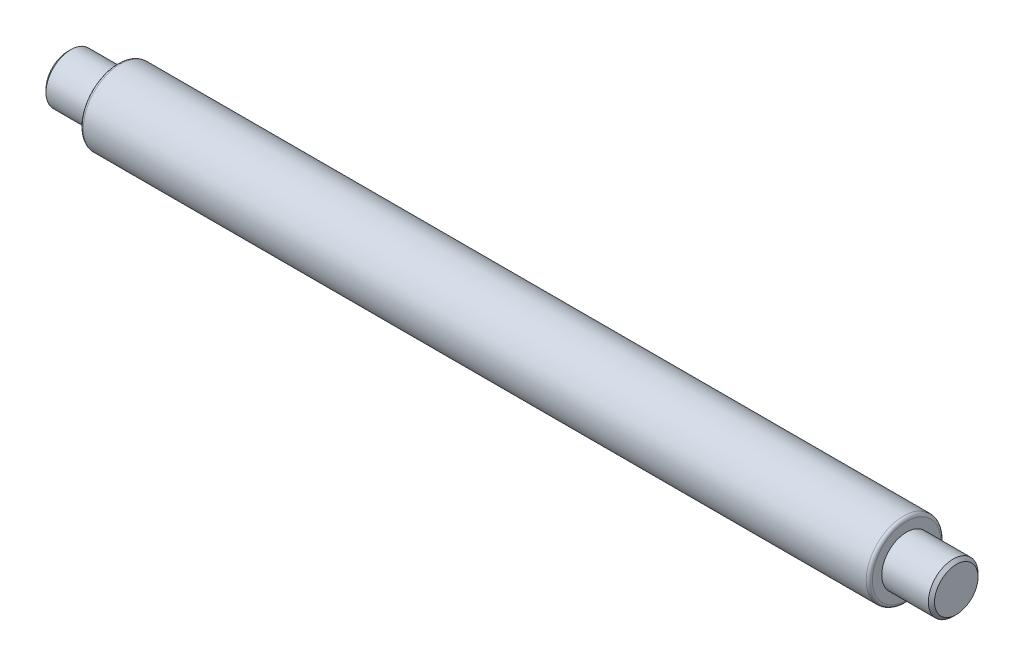
ISO-10303-21;
HEADER;
FILE_DESCRIPTION(('STEP AP214'),'2;1');
FILE_NAME('part.step','',(''),(''),'','','');
FILE_SCHEMA(('AUTOMOTIVE_DESIGN { 1 0 10303 214 1 1 1 1 }'));
ENDSEC;
DATA;
#1=APPLICATION_CONTEXT('core data for automotive mechanical design processes');
#2=APPLICATION_PROTOCOL_DEFINITION('international standard','automotive_design',2000,#1);
#3=PRODUCT_CONTEXT('',#1,'mechanical');
#4=PRODUCT('Part','Part','',(#3));
#5=PRODUCT_RELATED_PRODUCT_CATEGORY('part','',(#4));
#6=PRODUCT_DEFINITION_FORMATION('','',#4);
#7=PRODUCT_DEFINITION_CONTEXT('part definition',#1,'design');
#8=PRODUCT_DEFINITION('design','',#6,#7);
#9=PRODUCT_DEFINITION_SHAPE('','',#8);
#10=(LENGTH_UNIT() NAMED_UNIT(*) SI_UNIT(.MILLI.,.METRE.));
#11=(NAMED_UNIT(*) PLANE_ANGLE_UNIT() SI_UNIT($,.RADIAN.));
#12=(NAMED_UNIT(*) SI_UNIT($,.STERADIAN.) SOLID_ANGLE_UNIT());
#13=UNCERTAINTY_MEASURE_WITH_UNIT(LENGTH_MEASURE(1.E-05),#10,'distance_accuracy_value','');
#14=(GEOMETRIC_REPRESENTATION_CONTEXT(3) GLOBAL_UNCERTAINTY_ASSIGNED_CONTEXT((#13)) GLOBAL_UNIT_ASSIGNED_CONTEXT((#10,
#11,#12)) REPRESENTATION_CONTEXT('',''));
#15=CARTESIAN_POINT('',(0.,0.,0.));
#16=DIRECTION('',(0.,0.,1.));
#17=DIRECTION('',(1.,0.,0.));
#18=AXIS2_PLACEMENT_3D('',#15,#16,#17);
#19=CARTESIAN_POINT('',(-35.75,0.,0.));
#20=DIRECTION('',(1.,0.,0.));
#21=DIRECTION('',(0.,0.,-1.));
#22=AXIS2_PLACEMENT_3D('',#19,#20,#21);
#23=PLANE('',#22);
#24=CARTESIAN_POINT('',(-35.75,0.,0.));
#25=DIRECTION('',(1.,0.,0.));
#26=DIRECTION('',(0.,0.,-1.));
#27=AXIS2_PLACEMENT_3D('',#24,#25,#26);
#28=CIRCLE('',#27,1.75000000000001);
#29=CARTESIAN_POINT('',(-35.75,0.,-1.75000000000001));
#30=VERTEX_POINT('',#29);
#31=EDGE_CURVE('E83',#30,#30,#28,.F.);
#32=ORIENTED_EDGE('',*,*,#31,.T.);
#33=EDGE_LOOP('',(#32));
#34=FACE_BOUND('',#33,.T.);
#35=ADVANCED_FACE('F47',(#34),#23,.F.);
#36=CARTESIAN_POINT('',(-39.7757572103816,0.,0.));
#37=DIRECTION('',(-1.,0.,0.));
#38=DIRECTION('',(0.,0.,1.));
#39=AXIS2_PLACEMENT_3D('',#36,#37,#38);
#40=CYLINDRICAL_SURFACE('',#39,2.);
#41=CARTESIAN_POINT('',(-35.5,0.,0.));
#42=DIRECTION('',(1.,0.,0.));
#43=DIRECTION('',(0.,0.,-1.));
#44=AXIS2_PLACEMENT_3D('',#41,#42,#43);
#45=CIRCLE('',#44,2.);
#46=CARTESIAN_POINT('',(-35.5,0.,-2.));
#47=VERTEX_POINT('',#46);
#48=EDGE_CURVE('E79',#47,#47,#45,.T.);
#49=ORIENTED_EDGE('',*,*,#48,.T.);
#50=EDGE_LOOP('',(#49));
#51=FACE_BOUND('',#50,.T.);
#52=CARTESIAN_POINT('',(-31.75,0.,0.));
#53=DIRECTION('',(-1.,0.,0.));
#54=DIRECTION('',(0.,0.,1.));
#55=AXIS2_PLACEMENT_3D('',#52,#53,#54);
#56=CIRCLE('',#55,2.);
#57=CARTESIAN_POINT('',(-31.75,0.,2.));
#58=VERTEX_POINT('',#57);
#59=EDGE_CURVE('E87',#58,#58,#56,.T.);
#60=ORIENTED_EDGE('',*,*,#59,.T.);
#61=EDGE_LOOP('',(#60));
#62=FACE_BOUND('',#61,.T.);
#63=ADVANCED_FACE('F113',(#51,#62),#40,.T.);
#64=CARTESIAN_POINT('',(-31.75,2.,0.));
#65=DIRECTION('',(1.,0.,0.));
#66=DIRECTION('',(0.,0.,-1.));
#67=AXIS2_PLACEMENT_3D('',#64,#65,#66);
#68=PLANE('',#67);
#69=CARTESIAN_POINT('',(-31.75,0.,0.));
#70=DIRECTION('',(1.,0.,0.));
#71=DIRECTION('',(0.,0.,-1.));
#72=AXIS2_PLACEMENT_3D('',#69,#70,#71);
#73=CIRCLE('',#72,2.75);
#74=CARTESIAN_POINT('',(-31.75,0.,-2.75));
#75=VERTEX_POINT('',#74);
#76=EDGE_CURVE('E65',#75,#75,#73,.F.);
#77=ORIENTED_EDGE('',*,*,#76,.T.);
#78=EDGE_LOOP('',(#77));
#79=FACE_BOUND('',#78,.T.);
#80=ORIENTED_EDGE('',*,*,#59,.F.);
#81=EDGE_LOOP('',(#80));
#82=FACE_BOUND('',#81,.T.);
#83=ADVANCED_FACE('F119',(#79,#82),#68,.F.);
#84=CARTESIAN_POINT('',(-39.7757572103816,0.,0.));
#85=DIRECTION('',(-1.,0.,0.));
#86=DIRECTION('',(0.,0.,1.));
#87=AXIS2_PLACEMENT_3D('',#84,#85,#86);
#88=CYLINDRICAL_SURFACE('',#87,3.);
#89=CARTESIAN_POINT('',(-31.5,0.,0.));
#90=DIRECTION('',(1.,0.,0.));
#91=DIRECTION('',(0.,0.,-1.));
#92=AXIS2_PLACEMENT_3D('',#89,#90,#91);
#93=CIRCLE('',#92,3.);
#94=CARTESIAN_POINT('',(-31.5,0.,-3.));
#95=VERTEX_POINT('',#94);
#96=EDGE_CURVE('E55',#95,#95,#93,.T.);
#97=ORIENTED_EDGE('',*,*,#96,.T.);
#98=EDGE_LOOP('',(#97));
#99=FACE_BOUND('',#98,.T.);
#100=CARTESIAN_POINT('',(31.5,0.,0.));
#101=DIRECTION('',(-1.,0.,0.));
#102=DIRECTION('',(0.,0.,1.));
#103=AXIS2_PLACEMENT_3D('',#100,#101,#102);
#104=CIRCLE('',#103,3.);
#105=CARTESIAN_POINT('',(31.5,0.,3.));
#106=VERTEX_POINT('',#105);
#107=EDGE_CURVE('E60',#106,#106,#104,.T.);
#108=ORIENTED_EDGE('',*,*,#107,.T.);
#109=EDGE_LOOP('',(#108));
#110=FACE_BOUND('',#109,.T.);
#111=ADVANCED_FACE('F110',(#99,#110),#88,.T.);
#112=CARTESIAN_POINT('',(31.75,3.,0.));
#113=DIRECTION('',(-1.,0.,0.));
#114=DIRECTION('',(0.,0.,1.));
#115=AXIS2_PLACEMENT_3D('',#112,#113,#114);
#116=PLANE('',#115);
#117=CARTESIAN_POINT('',(31.75,0.,0.));
#118=DIRECTION('',(-1.,0.,0.));
#119=DIRECTION('',(0.,0.,1.));
#120=AXIS2_PLACEMENT_3D('',#117,#118,#119);
#121=CIRCLE('',#120,2.75);
#122=CARTESIAN_POINT('',(31.75,0.,2.75));
#123=VERTEX_POINT('',#122);
#124=EDGE_CURVE('E10',#123,#123,#121,.F.);
#125=ORIENTED_EDGE('',*,*,#124,.T.);
#126=EDGE_LOOP('',(#125));
#127=FACE_BOUND('',#126,.T.);
#128=CARTESIAN_POINT('',(31.75,0.,0.));
#129=DIRECTION('',(-1.,0.,0.));
#130=DIRECTION('',(0.,0.,1.));
#131=AXIS2_PLACEMENT_3D('',#128,#129,#130);
#132=CIRCLE('',#131,2.);
#133=CARTESIAN_POINT('',(31.75,0.,2.));
#134=VERTEX_POINT('',#133);
#135=EDGE_CURVE('E91',#134,#134,#132,.T.);
#136=ORIENTED_EDGE('',*,*,#135,.T.);
#137=EDGE_LOOP('',(#136));
#138=FACE_BOUND('',#137,.T.);
#139=ADVANCED_FACE('F96',(#127,#138),#116,.F.);
#140=CARTESIAN_POINT('',(-39.7757572103816,0.,0.));
#141=DIRECTION('',(-1.,0.,0.));
#142=DIRECTION('',(0.,0.,1.));
#143=AXIS2_PLACEMENT_3D('',#140,#141,#142);
#144=CYLINDRICAL_SURFACE('',#143,2.);
#145=CARTESIAN_POINT('',(35.5,0.,0.));
#146=DIRECTION('',(-1.,0.,0.));
#147=DIRECTION('',(0.,0.,1.));
#148=AXIS2_PLACEMENT_3D('',#145,#146,#147);
#149=CIRCLE('',#148,2.);
#150=CARTESIAN_POINT('',(35.5,0.,2.));
#151=VERTEX_POINT('',#150);
#152=EDGE_CURVE('E75',#151,#151,#149,.T.);
#153=ORIENTED_EDGE('',*,*,#152,.T.);
#154=EDGE_LOOP('',(#153));
#155=FACE_BOUND('',#154,.T.);
#156=ORIENTED_EDGE('',*,*,#135,.F.);
#157=EDGE_LOOP('',(#156));
#158=FACE_BOUND('',#157,.T.);
#159=ADVANCED_FACE('F98',(#155,#158),#144,.T.);
#160=CARTESIAN_POINT('',(35.75,2.,0.));
#161=DIRECTION('',(-1.,0.,0.));
#162=DIRECTION('',(0.,0.,1.));
#163=AXIS2_PLACEMENT_3D('',#160,#161,#162);
#164=PLANE('',#163);
#165=CARTESIAN_POINT('',(35.75,0.,0.));
#166=DIRECTION('',(-1.,0.,0.));
#167=DIRECTION('',(0.,0.,1.));
#168=AXIS2_PLACEMENT_3D('',#165,#166,#167);
#169=CIRCLE('',#168,1.75);
#170=CARTESIAN_POINT('',(35.75,0.,1.75));
#171=VERTEX_POINT('',#170);
#172=EDGE_CURVE('E71',#171,#171,#169,.F.);
#173=ORIENTED_EDGE('',*,*,#172,.T.);
#174=EDGE_LOOP('',(#173));
#175=FACE_BOUND('',#174,.T.);
#176=ADVANCED_FACE('F100',(#175),#164,.F.);
#177=CARTESIAN_POINT('',(-35.75,0.,0.));
#178=DIRECTION('',(1.,0.,0.));
#179=DIRECTION('',(0.,0.,-1.));
#180=AXIS2_PLACEMENT_3D('',#177,#178,#179);
#181=CONICAL_SURFACE('',#180,1.75000000000001,0.785398163397448);
#182=ORIENTED_EDGE('',*,*,#48,.F.);
#183=EDGE_LOOP('',(#182));
#184=FACE_BOUND('',#183,.T.);
#185=ORIENTED_EDGE('',*,*,#31,.F.);
#186=EDGE_LOOP('',(#185));
#187=FACE_BOUND('',#186,.T.);
#188=ADVANCED_FACE('F107',(#184,#187),#181,.T.);
#189=CARTESIAN_POINT('',(35.5,0.,0.));
#190=DIRECTION('',(-1.,0.,0.));
#191=DIRECTION('',(0.,0.,1.));
#192=AXIS2_PLACEMENT_3D('',#189,#190,#191);
#193=CONICAL_SURFACE('',#192,2.,0.785398163397443);
#194=ORIENTED_EDGE('',*,*,#172,.F.);
#195=EDGE_LOOP('',(#194));
#196=FACE_BOUND('',#195,.T.);
#197=ORIENTED_EDGE('',*,*,#152,.F.);
#198=EDGE_LOOP('',(#197));
#199=FACE_BOUND('',#198,.T.);
#200=ADVANCED_FACE('F130',(#196,#199),#193,.T.);
#201=CARTESIAN_POINT('',(-31.5,0.,0.));
#202=DIRECTION('',(1.,0.,0.));
#203=DIRECTION('',(0.,0.,-1.));
#204=AXIS2_PLACEMENT_3D('',#201,#202,#203);
#205=TOROIDAL_SURFACE('',#204,2.75,0.25);
#206=ORIENTED_EDGE('',*,*,#96,.F.);
#207=EDGE_LOOP('',(#206));
#208=FACE_BOUND('',#207,.T.);
#209=ORIENTED_EDGE('',*,*,#76,.F.);
#210=EDGE_LOOP('',(#209));
#211=FACE_BOUND('',#210,.T.);
#212=ADVANCED_FACE('F135',(#208,#211),#205,.T.);
#213=CARTESIAN_POINT('',(31.5,0.,0.));
#214=DIRECTION('',(-1.,0.,0.));
#215=DIRECTION('',(0.,0.,1.));
#216=AXIS2_PLACEMENT_3D('',#213,#214,#215);
#217=TOROIDAL_SURFACE('',#216,2.75,0.25);
#218=ORIENTED_EDGE('',*,*,#124,.F.);
#219=EDGE_LOOP('',(#218));
#220=FACE_BOUND('',#219,.T.);
#221=ORIENTED_EDGE('',*,*,#107,.F.);
#222=EDGE_LOOP('',(#221));
#223=FACE_BOUND('',#222,.T.);
#224=ADVANCED_FACE('F49',(#220,#223),#217,.T.);
#225=CLOSED_SHELL('',(#35,#63,#83,#111,#139,#159,#176,#188,#200,#212,#224));
#226=MANIFOLD_SOLID_BREP('B2',#225);
#227=ADVANCED_BREP_SHAPE_REPRESENTATION('',(#18,#226),#14);
#228=SHAPE_DEFINITION_REPRESENTATION(#9,#227);
ENDSEC;
END-ISO-10303-21;
